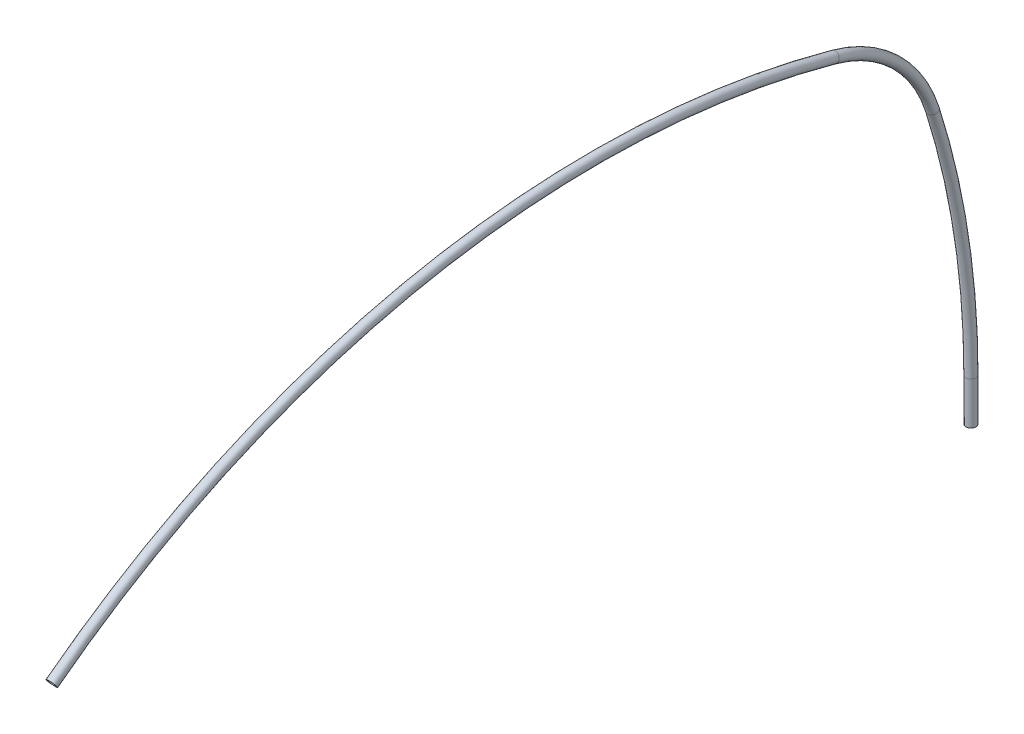
ISO-10303-21;
HEADER;
FILE_DESCRIPTION(('STEP AP214'),'2;1');
FILE_NAME('part.step','',(''),(''),'','','');
FILE_SCHEMA(('AUTOMOTIVE_DESIGN { 1 0 10303 214 1 1 1 1 }'));
ENDSEC;
DATA;
#1=APPLICATION_CONTEXT('core data for automotive mechanical design processes');
#2=APPLICATION_PROTOCOL_DEFINITION('international standard','automotive_design',2000,#1);
#3=PRODUCT_CONTEXT('',#1,'mechanical');
#4=PRODUCT('Part','Part','',(#3));
#5=PRODUCT_RELATED_PRODUCT_CATEGORY('part','',(#4));
#6=PRODUCT_DEFINITION_FORMATION('','',#4);
#7=PRODUCT_DEFINITION_CONTEXT('part definition',#1,'design');
#8=PRODUCT_DEFINITION('design','',#6,#7);
#9=PRODUCT_DEFINITION_SHAPE('','',#8);
#10=(LENGTH_UNIT() NAMED_UNIT(*) SI_UNIT(.MILLI.,.METRE.));
#11=(NAMED_UNIT(*) PLANE_ANGLE_UNIT() SI_UNIT($,.RADIAN.));
#12=(NAMED_UNIT(*) SI_UNIT($,.STERADIAN.) SOLID_ANGLE_UNIT());
#13=UNCERTAINTY_MEASURE_WITH_UNIT(LENGTH_MEASURE(1.E-05),#10,'distance_accuracy_value','');
#14=(GEOMETRIC_REPRESENTATION_CONTEXT(3) GLOBAL_UNCERTAINTY_ASSIGNED_CONTEXT((#13)) GLOBAL_UNIT_ASSIGNED_CONTEXT((#10,
#11,#12)) REPRESENTATION_CONTEXT('',''));
#15=CARTESIAN_POINT('',(0.,0.,0.));
#16=DIRECTION('',(0.,0.,1.));
#17=DIRECTION('',(1.,0.,0.));
#18=AXIS2_PLACEMENT_3D('',#15,#16,#17);
#19=CARTESIAN_POINT('',(0.,-436.788100218125,363.101537363582));
#20=DIRECTION('',(1.,0.,0.));
#21=DIRECTION('',(0.,0.,-1.));
#22=AXIS2_PLACEMENT_3D('',#19,#20,#21);
#23=TOROIDAL_SURFACE('',#22,895.076361416019,5.);
#24=CARTESIAN_POINT('',(0.,425.96799092423,124.745459273458));
#25=DIRECTION('',(0.,0.266296919866191,0.963891046991194));
#26=DIRECTION('',(0.,-0.963891046991194,0.266296919866191));
#27=AXIS2_PLACEMENT_3D('',#24,#25,#26);
#28=CIRCLE('',#27,5.);
#29=CARTESIAN_POINT('',(0.,430.787446159186,123.413974674127));
#30=VERTEX_POINT('',#29);
#31=EDGE_CURVE('E36',#30,#30,#28,.T.);
#32=CARTESIAN_POINT('',(0.,274.650793517897,906.255652919568));
#33=DIRECTION('',(0.,-0.606824332503555,0.794835976464085));
#34=DIRECTION('',(0.,-0.794835976464085,-0.606824332503555));
#35=AXIS2_PLACEMENT_3D('',#32,#33,#34);
#36=CIRCLE('',#35,5.);
#37=CARTESIAN_POINT('',(0.,278.624973400217,909.289774582086));
#38=VERTEX_POINT('',#37);
#39=EDGE_CURVE('E10',#38,#38,#36,.T.);
#40=CARTESIAN_POINT('',(0.,-436.788100218125,363.101537363582));
#41=DIRECTION('',(1.,0.,0.));
#42=DIRECTION('',(0.,0.,-1.));
#43=AXIS2_PLACEMENT_3D('',#40,#41,#42);
#44=CIRCLE('',#43,900.076361416019);
#45=EDGE_CURVE('',#30,#38,#44,.T.);
#46=ORIENTED_EDGE('',*,*,#31,.T.);
#47=ORIENTED_EDGE('',*,*,#39,.F.);
#48=ORIENTED_EDGE('',*,*,#45,.T.);
#49=ORIENTED_EDGE('',*,*,#45,.F.);
#50=EDGE_LOOP('',(#46,#48,#47,#49));
#51=FACE_BOUND('',#50,.T.);
#52=ADVANCED_FACE('F30',(#51),#23,.T.);
#53=CARTESIAN_POINT('',(0.,288.060220515682,162.845631071968));
#54=DIRECTION('',(1.,0.,0.));
#55=DIRECTION('',(0.,0.,-1.));
#56=AXIS2_PLACEMENT_3D('',#53,#54,#55);
#57=TOROIDAL_SURFACE('',#56,143.074023603632,5.);
#58=CARTESIAN_POINT('',(0.,331.227024004124,26.4388742498703));
#59=DIRECTION('',(0.,0.953399879212139,0.301709579427432));
#60=DIRECTION('',(0.,-0.301709579427432,0.953399879212139));
#61=AXIS2_PLACEMENT_3D('',#58,#59,#60);
#62=CIRCLE('',#61,5.);
#63=CARTESIAN_POINT('',(0.,332.735571901262,21.6718748538096));
#64=VERTEX_POINT('',#63);
#65=EDGE_CURVE('E40',#64,#64,#62,.T.);
#66=CARTESIAN_POINT('',(0.,288.060220515682,162.845631071968));
#67=DIRECTION('',(1.,0.,0.));
#68=DIRECTION('',(0.,0.,-1.));
#69=AXIS2_PLACEMENT_3D('',#66,#67,#68);
#70=CIRCLE('',#69,148.074023603632);
#71=EDGE_CURVE('',#64,#30,#70,.T.);
#72=ORIENTED_EDGE('',*,*,#65,.T.);
#73=ORIENTED_EDGE('',*,*,#31,.F.);
#74=ORIENTED_EDGE('',*,*,#71,.T.);
#75=ORIENTED_EDGE('',*,*,#71,.F.);
#76=EDGE_LOOP('',(#72,#74,#73,#75));
#77=FACE_BOUND('',#76,.T.);
#78=ADVANCED_FACE('F92',(#77),#57,.T.);
#79=CARTESIAN_POINT('',(0.,82.3569269417697,812.866408069133));
#80=DIRECTION('',(1.,0.,0.));
#81=DIRECTION('',(0.,0.,-1.));
#82=AXIS2_PLACEMENT_3D('',#79,#80,#81);
#83=TOROIDAL_SURFACE('',#82,824.866408069133,5.);
#84=CARTESIAN_POINT('',(0.,82.3569269417697,-12.));
#85=DIRECTION('',(0.,1.,0.));
#86=DIRECTION('',(0.,0.,1.));
#87=AXIS2_PLACEMENT_3D('',#84,#85,#86);
#88=CIRCLE('',#87,5.);
#89=CARTESIAN_POINT('',(0.,82.3569269417697,-16.9999999999999));
#90=VERTEX_POINT('',#89);
#91=EDGE_CURVE('E44',#90,#90,#88,.T.);
#92=CARTESIAN_POINT('',(0.,82.3569269417697,812.866408069133));
#93=DIRECTION('',(1.,0.,0.));
#94=DIRECTION('',(0.,0.,-1.));
#95=AXIS2_PLACEMENT_3D('',#92,#93,#94);
#96=CIRCLE('',#95,829.866408069133);
#97=EDGE_CURVE('',#90,#64,#96,.T.);
#98=ORIENTED_EDGE('',*,*,#91,.T.);
#99=ORIENTED_EDGE('',*,*,#65,.F.);
#100=ORIENTED_EDGE('',*,*,#97,.T.);
#101=ORIENTED_EDGE('',*,*,#97,.F.);
#102=EDGE_LOOP('',(#98,#100,#99,#101));
#103=FACE_BOUND('',#102,.T.);
#104=ADVANCED_FACE('F87',(#103),#83,.T.);
#105=CARTESIAN_POINT('',(0.,82.3569269417697,-12.));
#106=DIRECTION('',(0.,-1.,0.));
#107=DIRECTION('',(0.,0.,-1.));
#108=AXIS2_PLACEMENT_3D('',#105,#106,#107);
#109=CYLINDRICAL_SURFACE('',#108,5.);
#110=CARTESIAN_POINT('',(0.,40.,-12.));
#111=DIRECTION('',(0.,1.,0.));
#112=DIRECTION('',(0.,0.,1.));
#113=AXIS2_PLACEMENT_3D('',#110,#111,#112);
#114=CIRCLE('',#113,5.);
#115=CARTESIAN_POINT('',(0.,40.,-17.));
#116=VERTEX_POINT('',#115);
#117=EDGE_CURVE('E47',#116,#116,#114,.T.);
#118=CARTESIAN_POINT('',(0.,82.3569269417697,-17.));
#119=CARTESIAN_POINT('',(0.,81.915708952793,-17.));
#120=CARTESIAN_POINT('',(0.,81.4744909638162,-17.));
#121=CARTESIAN_POINT('',(0.,80.5920549858626,-17.));
#122=CARTESIAN_POINT('',(0.,80.1508369968859,-17.));
#123=CARTESIAN_POINT('',(0.,79.2684010189323,-17.));
#124=CARTESIAN_POINT('',(0.,78.8271830299556,-17.));
#125=CARTESIAN_POINT('',(0.,77.944747052002,-17.));
#126=CARTESIAN_POINT('',(0.,77.5035290630253,-17.));
#127=CARTESIAN_POINT('',(0.,76.6210930850717,-17.));
#128=CARTESIAN_POINT('',(0.,76.179875096095,-17.));
#129=CARTESIAN_POINT('',(0.,75.2974391181414,-17.));
#130=CARTESIAN_POINT('',(0.,74.8562211291647,-17.));
#131=CARTESIAN_POINT('',(0.,73.9737851512111,-17.));
#132=CARTESIAN_POINT('',(0.,73.5325671622344,-17.));
#133=CARTESIAN_POINT('',(0.,72.6501311842808,-17.));
#134=CARTESIAN_POINT('',(0.,72.2089131953041,-17.));
#135=CARTESIAN_POINT('',(0.,71.3264772173505,-17.));
#136=CARTESIAN_POINT('',(0.,70.8852592283738,-17.));
#137=CARTESIAN_POINT('',(0.,70.0028232504202,-17.));
#138=CARTESIAN_POINT('',(0.,69.5616052614435,-17.));
#139=CARTESIAN_POINT('',(0.,68.6791692834899,-17.));
#140=CARTESIAN_POINT('',(0.,68.2379512945132,-17.));
#141=CARTESIAN_POINT('',(0.,67.3555153165596,-17.));
#142=CARTESIAN_POINT('',(0.,66.9142973275828,-17.));
#143=CARTESIAN_POINT('',(0.,66.0318613496293,-17.));
#144=CARTESIAN_POINT('',(0.,65.5906433606525,-17.));
#145=CARTESIAN_POINT('',(0.,64.708207382699,-17.));
#146=CARTESIAN_POINT('',(0.,64.2669893937222,-17.));
#147=CARTESIAN_POINT('',(0.,63.3845534157687,-17.));
#148=CARTESIAN_POINT('',(0.,62.9433354267919,-17.));
#149=CARTESIAN_POINT('',(0.,62.0608994488384,-17.));
#150=CARTESIAN_POINT('',(0.,61.6196814598616,-17.));
#151=CARTESIAN_POINT('',(0.,60.7372454819081,-17.));
#152=CARTESIAN_POINT('',(0.,60.2960274929313,-17.));
#153=CARTESIAN_POINT('',(0.,59.4135915149778,-17.));
#154=CARTESIAN_POINT('',(0.,58.972373526001,-17.));
#155=CARTESIAN_POINT('',(0.,58.0899375480475,-17.));
#156=CARTESIAN_POINT('',(0.,57.6487195590707,-17.));
#157=CARTESIAN_POINT('',(0.,56.7662835811172,-17.));
#158=CARTESIAN_POINT('',(0.,56.3250655921404,-17.));
#159=CARTESIAN_POINT('',(0.,55.4426296141869,-17.));
#160=CARTESIAN_POINT('',(0.,55.0014116252101,-17.));
#161=CARTESIAN_POINT('',(0.,54.1189756472566,-17.));
#162=CARTESIAN_POINT('',(0.,53.6777576582798,-17.));
#163=CARTESIAN_POINT('',(0.,52.7953216803263,-17.));
#164=CARTESIAN_POINT('',(0.,52.3541036913495,-17.));
#165=CARTESIAN_POINT('',(0.,51.471667713396,-17.));
#166=CARTESIAN_POINT('',(0.,51.0304497244192,-17.));
#167=CARTESIAN_POINT('',(0.,50.1480137464657,-17.));
#168=CARTESIAN_POINT('',(0.,49.7067957574889,-17.));
#169=CARTESIAN_POINT('',(0.,48.8243597795354,-17.));
#170=CARTESIAN_POINT('',(0.,48.3831417905586,-17.));
#171=CARTESIAN_POINT('',(0.,47.5007058126051,-17.));
#172=CARTESIAN_POINT('',(0.,47.0594878236283,-17.));
#173=CARTESIAN_POINT('',(0.,46.1770518456748,-17.));
#174=CARTESIAN_POINT('',(0.,45.735833856698,-17.));
#175=CARTESIAN_POINT('',(0.,44.8533978787445,-17.));
#176=CARTESIAN_POINT('',(0.,44.4121798897677,-17.));
#177=CARTESIAN_POINT('',(0.,43.5297439118142,-17.));
#178=CARTESIAN_POINT('',(0.,43.0885259228374,-17.));
#179=CARTESIAN_POINT('',(0.,42.2060899448839,-17.));
#180=CARTESIAN_POINT('',(0.,41.7648719559071,-17.));
#181=CARTESIAN_POINT('',(0.,40.8824359779535,-17.));
#182=CARTESIAN_POINT('',(0.,40.4412179889768,-17.));
#183=CARTESIAN_POINT('',(0.,40.,-17.));
#184=B_SPLINE_CURVE_WITH_KNOTS('',3,(#118,#119,#120,#121,#122,#123,#124,#125,#126,#127,#128,
#129,#130,#131,#132,#133,#134,#135,#136,#137,#138,#139,#140,#141,#142,#143,#144,#145,#146,#147,
#148,#149,#150,#151,#152,#153,#154,#155,#156,#157,#158,#159,#160,#161,#162,#163,#164,#165,#166,
#167,#168,#169,#170,#171,#172,#173,#174,#175,#176,#177,#178,#179,#180,#181,#182,#183),
.UNSPECIFIED.,.F.,.F.,(4,2,2,2,2,2,2,2,2,2,2,2,2,2,2,2,2,2,2,2,2,2,2,2,2,2,2,2,2,2,2,2,4),(0.,
1.32365396693031,2.64730793386062,3.97096190079092,5.29461586772122,6.61826983465152,
7.94192380158183,9.26557776851213,10.5892317354424,11.9128857023727,13.236539669303,
14.5601936362333,15.8838476031636,17.2075015700939,18.5311555370243,19.8548095039546,
21.1784634708849,22.5021174378152,23.8257714047455,25.1494253716758,26.4730793386061,
27.7967333055364,29.1203872724667,30.444041239397,31.7676952063273,33.0913491732576,
34.4150031401879,35.7386571071182,37.0623110740485,38.3859650409788,39.7096190079091,
41.0332729748394,42.3569269417697),.UNSPECIFIED.);
#185=EDGE_CURVE('BSEAM79',#90,#116,#184,.T.);
#186=ORIENTED_EDGE('',*,*,#91,.F.);
#187=ORIENTED_EDGE('',*,*,#117,.T.);
#188=ORIENTED_EDGE('',*,*,#185,.T.);
#189=ORIENTED_EDGE('',*,*,#185,.F.);
#190=EDGE_LOOP('',(#186,#188,#187,#189));
#191=FACE_BOUND('',#190,.T.);
#192=ADVANCED_FACE('F79',(#191),#109,.T.);
#193=CARTESIAN_POINT('',(0.,274.650793517897,906.255652919568));
#194=DIRECTION('',(0.,-0.606824332503555,0.794835976464085));
#195=DIRECTION('',(0.,-0.794835976464085,-0.606824332503555));
#196=AXIS2_PLACEMENT_3D('',#193,#194,#195);
#197=PLANE('',#196);
#198=CARTESIAN_POINT('',(0.,274.650793517897,906.255652919568));
#199=DIRECTION('',(0.,-0.606824332503555,0.794835976464085));
#200=DIRECTION('',(0.,-0.794835976464085,-0.606824332503555));
#201=AXIS2_PLACEMENT_3D('',#198,#199,#200);
#202=CIRCLE('',#201,4.);
#203=CARTESIAN_POINT('',(0.,277.830137423753,908.682950249582));
#204=VERTEX_POINT('',#203);
#205=EDGE_CURVE('E50',#204,#204,#202,.T.);
#206=ORIENTED_EDGE('',*,*,#205,.F.);
#207=EDGE_LOOP('',(#206));
#208=FACE_BOUND('',#207,.T.);
#209=ORIENTED_EDGE('',*,*,#39,.T.);
#210=EDGE_LOOP('',(#209));
#211=FACE_BOUND('',#210,.T.);
#212=ADVANCED_FACE('F77',(#208,#211),#197,.T.);
#213=CARTESIAN_POINT('',(0.,40.,-12.));
#214=DIRECTION('',(0.,1.,0.));
#215=DIRECTION('',(0.,0.,1.));
#216=AXIS2_PLACEMENT_3D('',#213,#214,#215);
#217=PLANE('',#216);
#218=CARTESIAN_POINT('',(0.,40.,-12.));
#219=DIRECTION('',(0.,1.,0.));
#220=DIRECTION('',(0.,0.,1.));
#221=AXIS2_PLACEMENT_3D('',#218,#219,#220);
#222=CIRCLE('',#221,4.);
#223=CARTESIAN_POINT('',(0.,40.,-16.));
#224=VERTEX_POINT('',#223);
#225=EDGE_CURVE('E53',#224,#224,#222,.T.);
#226=ORIENTED_EDGE('',*,*,#225,.T.);
#227=EDGE_LOOP('',(#226));
#228=FACE_BOUND('',#227,.T.);
#229=ORIENTED_EDGE('',*,*,#117,.F.);
#230=EDGE_LOOP('',(#229));
#231=FACE_BOUND('',#230,.T.);
#232=ADVANCED_FACE('F73',(#228,#231),#217,.F.);
#233=CARTESIAN_POINT('',(0.,-436.788100218125,363.101537363582));
#234=DIRECTION('',(1.,0.,0.));
#235=DIRECTION('',(0.,0.,-1.));
#236=AXIS2_PLACEMENT_3D('',#233,#234,#235);
#237=TOROIDAL_SURFACE('',#236,895.076361416019,4.);
#238=CARTESIAN_POINT('',(0.,425.96799092423,124.745459273458));
#239=DIRECTION('',(0.,-0.266296919866191,-0.963891046991194));
#240=DIRECTION('',(0.,0.963891046991194,-0.266296919866191));
#241=AXIS2_PLACEMENT_3D('',#238,#239,#240);
#242=CIRCLE('',#241,4.);
#243=CARTESIAN_POINT('',(0.,429.823555112195,123.680271593993));
#244=VERTEX_POINT('',#243);
#245=EDGE_CURVE('E59',#244,#244,#242,.F.);
#246=CARTESIAN_POINT('',(0.,-436.788100218125,363.101537363582));
#247=DIRECTION('',(1.,0.,0.));
#248=DIRECTION('',(0.,0.,-1.));
#249=AXIS2_PLACEMENT_3D('',#246,#247,#248);
#250=CIRCLE('',#249,899.076361416019);
#251=EDGE_CURVE('',#244,#204,#250,.T.);
#252=ORIENTED_EDGE('',*,*,#245,.F.);
#253=ORIENTED_EDGE('',*,*,#205,.T.);
#254=ORIENTED_EDGE('',*,*,#251,.T.);
#255=ORIENTED_EDGE('',*,*,#251,.F.);
#256=EDGE_LOOP('',(#252,#254,#253,#255));
#257=FACE_BOUND('',#256,.T.);
#258=ADVANCED_FACE('F70',(#257),#237,.F.);
#259=CARTESIAN_POINT('',(0.,288.060220515682,162.845631071968));
#260=DIRECTION('',(1.,0.,0.));
#261=DIRECTION('',(0.,0.,-1.));
#262=AXIS2_PLACEMENT_3D('',#259,#260,#261);
#263=TOROIDAL_SURFACE('',#262,143.074023603632,4.);
#264=CARTESIAN_POINT('',(0.,331.227024004124,26.4388742498703));
#265=DIRECTION('',(0.,-0.953399879212139,-0.301709579427432));
#266=DIRECTION('',(0.,0.301709579427432,-0.953399879212139));
#267=AXIS2_PLACEMENT_3D('',#264,#265,#266);
#268=CIRCLE('',#267,4.);
#269=CARTESIAN_POINT('',(0.,332.433862321834,22.6252747330217));
#270=VERTEX_POINT('',#269);
#271=EDGE_CURVE('E62',#270,#270,#268,.F.);
#272=CARTESIAN_POINT('',(0.,288.060220515682,162.845631071968));
#273=DIRECTION('',(1.,0.,0.));
#274=DIRECTION('',(0.,0.,-1.));
#275=AXIS2_PLACEMENT_3D('',#272,#273,#274);
#276=CIRCLE('',#275,147.074023603632);
#277=EDGE_CURVE('',#270,#244,#276,.T.);
#278=ORIENTED_EDGE('',*,*,#271,.F.);
#279=ORIENTED_EDGE('',*,*,#245,.T.);
#280=ORIENTED_EDGE('',*,*,#277,.T.);
#281=ORIENTED_EDGE('',*,*,#277,.F.);
#282=EDGE_LOOP('',(#278,#280,#279,#281));
#283=FACE_BOUND('',#282,.T.);
#284=ADVANCED_FACE('F68',(#283),#263,.F.);
#285=CARTESIAN_POINT('',(0.,82.3569269417697,812.866408069133));
#286=DIRECTION('',(1.,0.,0.));
#287=DIRECTION('',(0.,0.,-1.));
#288=AXIS2_PLACEMENT_3D('',#285,#286,#287);
#289=TOROIDAL_SURFACE('',#288,824.866408069133,4.);
#290=CARTESIAN_POINT('',(0.,82.3569269417697,-12.));
#291=DIRECTION('',(0.,-1.,0.));
#292=DIRECTION('',(0.,0.,-1.));
#293=AXIS2_PLACEMENT_3D('',#290,#291,#292);
#294=CIRCLE('',#293,4.);
#295=CARTESIAN_POINT('',(0.,82.3569269417697,-15.9999999999999));
#296=VERTEX_POINT('',#295);
#297=EDGE_CURVE('E56',#296,#296,#294,.F.);
#298=CARTESIAN_POINT('',(0.,82.3569269417697,812.866408069133));
#299=DIRECTION('',(1.,0.,0.));
#300=DIRECTION('',(0.,0.,-1.));
#301=AXIS2_PLACEMENT_3D('',#298,#299,#300);
#302=CIRCLE('',#301,828.866408069133);
#303=EDGE_CURVE('',#296,#270,#302,.T.);
#304=ORIENTED_EDGE('',*,*,#297,.F.);
#305=ORIENTED_EDGE('',*,*,#271,.T.);
#306=ORIENTED_EDGE('',*,*,#303,.T.);
#307=ORIENTED_EDGE('',*,*,#303,.F.);
#308=EDGE_LOOP('',(#304,#306,#305,#307));
#309=FACE_BOUND('',#308,.T.);
#310=ADVANCED_FACE('F144',(#309),#289,.F.);
#311=CARTESIAN_POINT('',(0.,82.3569269417697,-12.));
#312=DIRECTION('',(0.,-1.,0.));
#313=DIRECTION('',(0.,0.,-1.));
#314=AXIS2_PLACEMENT_3D('',#311,#312,#313);
#315=CYLINDRICAL_SURFACE('',#314,4.);
#316=CARTESIAN_POINT('',(0.,82.3569269417697,-16.));
#317=CARTESIAN_POINT('',(0.,81.9157089527929,-16.));
#318=CARTESIAN_POINT('',(0.,81.4744909638162,-16.));
#319=CARTESIAN_POINT('',(0.,80.5920549858626,-16.));
#320=CARTESIAN_POINT('',(0.,80.1508369968859,-16.));
#321=CARTESIAN_POINT('',(0.,79.2684010189323,-16.));
#322=CARTESIAN_POINT('',(0.,78.8271830299556,-16.));
#323=CARTESIAN_POINT('',(0.,77.944747052002,-16.));
#324=CARTESIAN_POINT('',(0.,77.5035290630253,-16.));
#325=CARTESIAN_POINT('',(0.,76.6210930850717,-16.));
#326=CARTESIAN_POINT('',(0.,76.179875096095,-16.));
#327=CARTESIAN_POINT('',(0.,75.2974391181414,-16.));
#328=CARTESIAN_POINT('',(0.,74.8562211291647,-16.));
#329=CARTESIAN_POINT('',(0.,73.9737851512111,-16.));
#330=CARTESIAN_POINT('',(0.,73.5325671622344,-16.));
#331=CARTESIAN_POINT('',(0.,72.6501311842808,-16.));
#332=CARTESIAN_POINT('',(0.,72.2089131953041,-16.));
#333=CARTESIAN_POINT('',(0.,71.3264772173505,-16.));
#334=CARTESIAN_POINT('',(0.,70.8852592283738,-16.));
#335=CARTESIAN_POINT('',(0.,70.0028232504202,-16.));
#336=CARTESIAN_POINT('',(0.,69.5616052614435,-16.));
#337=CARTESIAN_POINT('',(0.,68.6791692834899,-16.));
#338=CARTESIAN_POINT('',(0.,68.2379512945132,-16.));
#339=CARTESIAN_POINT('',(0.,67.3555153165596,-16.));
#340=CARTESIAN_POINT('',(0.,66.9142973275828,-16.));
#341=CARTESIAN_POINT('',(0.,66.0318613496293,-16.));
#342=CARTESIAN_POINT('',(0.,65.5906433606525,-16.));
#343=CARTESIAN_POINT('',(0.,64.708207382699,-16.));
#344=CARTESIAN_POINT('',(0.,64.2669893937222,-16.));
#345=CARTESIAN_POINT('',(0.,63.3845534157687,-16.));
#346=CARTESIAN_POINT('',(0.,62.9433354267919,-16.));
#347=CARTESIAN_POINT('',(0.,62.0608994488384,-16.));
#348=CARTESIAN_POINT('',(0.,61.6196814598616,-16.));
#349=CARTESIAN_POINT('',(0.,60.7372454819081,-16.));
#350=CARTESIAN_POINT('',(0.,60.2960274929313,-16.));
#351=CARTESIAN_POINT('',(0.,59.4135915149778,-16.));
#352=CARTESIAN_POINT('',(0.,58.972373526001,-16.));
#353=CARTESIAN_POINT('',(0.,58.0899375480475,-16.));
#354=CARTESIAN_POINT('',(0.,57.6487195590707,-16.));
#355=CARTESIAN_POINT('',(0.,56.7662835811172,-16.));
#356=CARTESIAN_POINT('',(0.,56.3250655921404,-16.));
#357=CARTESIAN_POINT('',(0.,55.4426296141869,-16.));
#358=CARTESIAN_POINT('',(0.,55.0014116252101,-16.));
#359=CARTESIAN_POINT('',(0.,54.1189756472566,-16.));
#360=CARTESIAN_POINT('',(0.,53.6777576582798,-16.));
#361=CARTESIAN_POINT('',(0.,52.7953216803263,-16.));
#362=CARTESIAN_POINT('',(0.,52.3541036913495,-16.));
#363=CARTESIAN_POINT('',(0.,51.471667713396,-16.));
#364=CARTESIAN_POINT('',(0.,51.0304497244192,-16.));
#365=CARTESIAN_POINT('',(0.,50.1480137464657,-16.));
#366=CARTESIAN_POINT('',(0.,49.7067957574889,-16.));
#367=CARTESIAN_POINT('',(0.,48.8243597795354,-16.));
#368=CARTESIAN_POINT('',(0.,48.3831417905586,-16.));
#369=CARTESIAN_POINT('',(0.,47.5007058126051,-16.));
#370=CARTESIAN_POINT('',(0.,47.0594878236283,-16.));
#371=CARTESIAN_POINT('',(0.,46.1770518456748,-16.));
#372=CARTESIAN_POINT('',(0.,45.735833856698,-16.));
#373=CARTESIAN_POINT('',(0.,44.8533978787445,-16.));
#374=CARTESIAN_POINT('',(0.,44.4121798897677,-16.));
#375=CARTESIAN_POINT('',(0.,43.5297439118142,-16.));
#376=CARTESIAN_POINT('',(0.,43.0885259228374,-16.));
#377=CARTESIAN_POINT('',(0.,42.2060899448839,-16.));
#378=CARTESIAN_POINT('',(0.,41.7648719559071,-16.));
#379=CARTESIAN_POINT('',(0.,40.8824359779535,-16.));
#380=CARTESIAN_POINT('',(0.,40.4412179889768,-16.));
#381=CARTESIAN_POINT('',(0.,40.,-16.));
#382=B_SPLINE_CURVE_WITH_KNOTS('',3,(#316,#317,#318,#319,#320,#321,#322,#323,#324,#325,#326,
#327,#328,#329,#330,#331,#332,#333,#334,#335,#336,#337,#338,#339,#340,#341,#342,#343,#344,#345,
#346,#347,#348,#349,#350,#351,#352,#353,#354,#355,#356,#357,#358,#359,#360,#361,#362,#363,#364,
#365,#366,#367,#368,#369,#370,#371,#372,#373,#374,#375,#376,#377,#378,#379,#380,#381),
.UNSPECIFIED.,.F.,.F.,(4,2,2,2,2,2,2,2,2,2,2,2,2,2,2,2,2,2,2,2,2,2,2,2,2,2,2,2,2,2,2,2,4),(0.,
1.32365396693029,2.6473079338606,3.97096190079091,5.2946158677212,6.61826983465151,
7.94192380158182,9.26557776851211,10.5892317354424,11.9128857023727,13.236539669303,
14.5601936362333,15.8838476031636,17.2075015700939,18.5311555370242,19.8548095039545,
21.1784634708848,22.5021174378151,23.8257714047455,25.1494253716758,26.4730793386061,
27.7967333055364,29.1203872724667,30.444041239397,31.7676952063273,33.0913491732576,
34.4150031401879,35.7386571071182,37.0623110740485,38.3859650409788,39.7096190079091,
41.0332729748394,42.3569269417697),.UNSPECIFIED.);
#383=EDGE_CURVE('BSEAM154',#296,#224,#382,.T.);
#384=ORIENTED_EDGE('',*,*,#297,.T.);
#385=ORIENTED_EDGE('',*,*,#225,.F.);
#386=ORIENTED_EDGE('',*,*,#383,.T.);
#387=ORIENTED_EDGE('',*,*,#383,.F.);
#388=EDGE_LOOP('',(#384,#386,#385,#387));
#389=FACE_BOUND('',#388,.T.);
#390=ADVANCED_FACE('F154',(#389),#315,.F.);
#391=CLOSED_SHELL('',(#52,#78,#104,#192,#212,#232,#258,#284,#310,#390));
#392=MANIFOLD_SOLID_BREP('B2',#391);
#393=ADVANCED_BREP_SHAPE_REPRESENTATION('',(#18,#392),#14);
#394=SHAPE_DEFINITION_REPRESENTATION(#9,#393);
ENDSEC;
END-ISO-10303-21;
